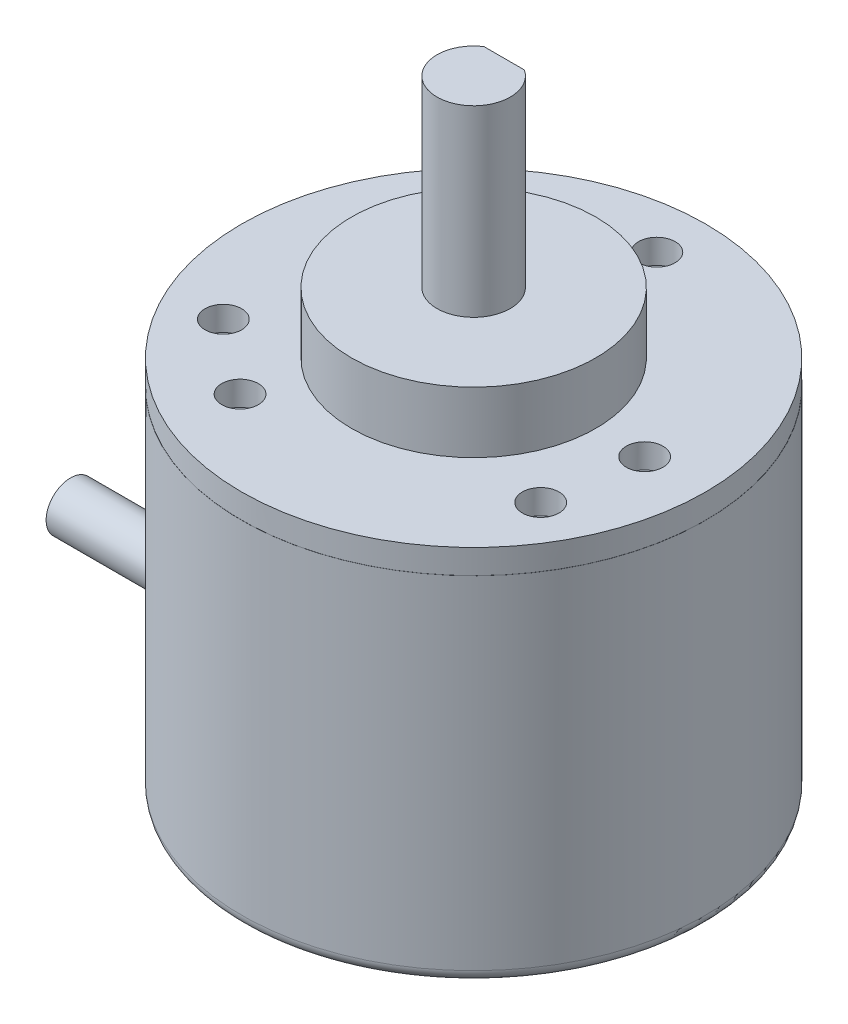
ISO-10303-21;
HEADER;
FILE_DESCRIPTION(('STEP AP214'),'2;1');
FILE_NAME('part.step','',(''),(''),'','','');
FILE_SCHEMA(('AUTOMOTIVE_DESIGN { 1 0 10303 214 1 1 1 1 }'));
ENDSEC;
DATA;
#1=APPLICATION_CONTEXT('core data for automotive mechanical design processes');
#2=APPLICATION_PROTOCOL_DEFINITION('international standard','automotive_design',2000,#1);
#3=PRODUCT_CONTEXT('',#1,'mechanical');
#4=PRODUCT('Part','Part','',(#3));
#5=PRODUCT_RELATED_PRODUCT_CATEGORY('part','',(#4));
#6=PRODUCT_DEFINITION_FORMATION('','',#4);
#7=PRODUCT_DEFINITION_CONTEXT('part definition',#1,'design');
#8=PRODUCT_DEFINITION('design','',#6,#7);
#9=PRODUCT_DEFINITION_SHAPE('','',#8);
#10=(LENGTH_UNIT() NAMED_UNIT(*) SI_UNIT(.MILLI.,.METRE.));
#11=(NAMED_UNIT(*) PLANE_ANGLE_UNIT() SI_UNIT($,.RADIAN.));
#12=(NAMED_UNIT(*) SI_UNIT($,.STERADIAN.) SOLID_ANGLE_UNIT());
#13=UNCERTAINTY_MEASURE_WITH_UNIT(LENGTH_MEASURE(1.E-05),#10,'distance_accuracy_value','');
#14=(GEOMETRIC_REPRESENTATION_CONTEXT(3) GLOBAL_UNCERTAINTY_ASSIGNED_CONTEXT((#13)) GLOBAL_UNIT_ASSIGNED_CONTEXT((#10,
#11,#12)) REPRESENTATION_CONTEXT('',''));
#15=CARTESIAN_POINT('',(0.,0.,0.));
#16=DIRECTION('',(0.,0.,1.));
#17=DIRECTION('',(1.,0.,0.));
#18=AXIS2_PLACEMENT_3D('',#15,#16,#17);
#19=CARTESIAN_POINT('',(0.,31.,0.));
#20=DIRECTION('',(0.,-1.,0.));
#21=DIRECTION('',(0.,0.,-1.));
#22=AXIS2_PLACEMENT_3D('',#19,#20,#21);
#23=CYLINDRICAL_SURFACE('',#22,19.);
#24=CARTESIAN_POINT('',(0.,31.,0.));
#25=DIRECTION('',(0.,1.,0.));
#26=DIRECTION('',(0.,0.,1.));
#27=AXIS2_PLACEMENT_3D('',#24,#25,#26);
#28=CIRCLE('',#27,19.);
#29=CARTESIAN_POINT('',(0.,31.,19.));
#30=VERTEX_POINT('',#29);
#31=EDGE_CURVE('E137',#30,#30,#28,.T.);
#32=ORIENTED_EDGE('',*,*,#31,.F.);
#33=EDGE_LOOP('',(#32));
#34=FACE_BOUND('',#33,.T.);
#35=CARTESIAN_POINT('',(0.,29.,0.));
#36=DIRECTION('',(0.,-1.,0.));
#37=DIRECTION('',(0.,0.,-1.));
#38=AXIS2_PLACEMENT_3D('',#35,#36,#37);
#39=CIRCLE('',#38,19.);
#40=CARTESIAN_POINT('',(0.,29.,-19.));
#41=VERTEX_POINT('',#40);
#42=EDGE_CURVE('E222',#41,#41,#39,.T.);
#43=ORIENTED_EDGE('',*,*,#42,.F.);
#44=EDGE_LOOP('',(#43));
#45=FACE_BOUND('',#44,.T.);
#46=ADVANCED_FACE('F47',(#34,#45),#23,.T.);
#47=CARTESIAN_POINT('',(14.,26.,0.));
#48=DIRECTION('',(0.,1.,0.));
#49=DIRECTION('',(0.,0.,1.));
#50=AXIS2_PLACEMENT_3D('',#47,#48,#49);
#51=CYLINDRICAL_SURFACE('',#50,1.5);
#52=CARTESIAN_POINT('',(14.,31.,0.));
#53=DIRECTION('',(0.,1.,0.));
#54=DIRECTION('',(0.,0.,1.));
#55=AXIS2_PLACEMENT_3D('',#52,#53,#54);
#56=CIRCLE('',#55,1.5);
#57=CARTESIAN_POINT('',(14.,31.,1.5));
#58=VERTEX_POINT('',#57);
#59=EDGE_CURVE('E270',#58,#58,#56,.T.);
#60=ORIENTED_EDGE('',*,*,#59,.T.);
#61=EDGE_LOOP('',(#60));
#62=FACE_BOUND('',#61,.T.);
#63=CARTESIAN_POINT('',(14.,29.,0.));
#64=DIRECTION('',(0.,-1.,0.));
#65=DIRECTION('',(0.,0.,-1.));
#66=AXIS2_PLACEMENT_3D('',#63,#64,#65);
#67=CIRCLE('',#66,1.5);
#68=CARTESIAN_POINT('',(14.,29.,-1.5));
#69=VERTEX_POINT('',#68);
#70=EDGE_CURVE('E225',#69,#69,#67,.F.);
#71=ORIENTED_EDGE('',*,*,#70,.F.);
#72=EDGE_LOOP('',(#71));
#73=FACE_BOUND('',#72,.T.);
#74=ADVANCED_FACE('F210',(#62,#73),#51,.F.);
#75=CARTESIAN_POINT('',(-7.00000000000002,26.,-12.1243556529821));
#76=DIRECTION('',(0.,1.,0.));
#77=DIRECTION('',(0.,0.,1.));
#78=AXIS2_PLACEMENT_3D('',#75,#76,#77);
#79=CYLINDRICAL_SURFACE('',#78,1.5);
#80=CARTESIAN_POINT('',(-7.00000000000002,31.,-12.1243556529821));
#81=DIRECTION('',(0.,1.,0.));
#82=DIRECTION('',(0.,0.,1.));
#83=AXIS2_PLACEMENT_3D('',#80,#81,#82);
#84=CIRCLE('',#83,1.5);
#85=CARTESIAN_POINT('',(-7.00000000000002,31.,-10.6243556529821));
#86=VERTEX_POINT('',#85);
#87=EDGE_CURVE('E253',#86,#86,#84,.T.);
#88=ORIENTED_EDGE('',*,*,#87,.T.);
#89=EDGE_LOOP('',(#88));
#90=FACE_BOUND('',#89,.T.);
#91=CARTESIAN_POINT('',(-7.00000000000002,29.,-12.1243556529821));
#92=DIRECTION('',(0.,-1.,0.));
#93=DIRECTION('',(0.,0.,-1.));
#94=AXIS2_PLACEMENT_3D('',#91,#92,#93);
#95=CIRCLE('',#94,1.5);
#96=CARTESIAN_POINT('',(-7.00000000000002,29.,-13.6243556529821));
#97=VERTEX_POINT('',#96);
#98=EDGE_CURVE('E230',#97,#97,#95,.F.);
#99=ORIENTED_EDGE('',*,*,#98,.F.);
#100=EDGE_LOOP('',(#99));
#101=FACE_BOUND('',#100,.T.);
#102=ADVANCED_FACE('F215',(#90,#101),#79,.F.);
#103=CARTESIAN_POINT('',(12.9903810567666,26.,7.50000000000001));
#104=DIRECTION('',(0.,1.,0.));
#105=DIRECTION('',(0.,0.,1.));
#106=AXIS2_PLACEMENT_3D('',#103,#104,#105);
#107=CYLINDRICAL_SURFACE('',#106,1.5);
#108=CARTESIAN_POINT('',(12.9903810567666,31.,7.50000000000001));
#109=DIRECTION('',(0.,1.,0.));
#110=DIRECTION('',(0.,0.,1.));
#111=AXIS2_PLACEMENT_3D('',#108,#109,#110);
#112=CIRCLE('',#111,1.5);
#113=CARTESIAN_POINT('',(12.9903810567666,31.,9.00000000000001));
#114=VERTEX_POINT('',#113);
#115=EDGE_CURVE('E266',#114,#114,#112,.T.);
#116=ORIENTED_EDGE('',*,*,#115,.T.);
#117=EDGE_LOOP('',(#116));
#118=FACE_BOUND('',#117,.T.);
#119=CARTESIAN_POINT('',(12.9903810567666,29.,7.50000000000001));
#120=DIRECTION('',(0.,-1.,0.));
#121=DIRECTION('',(0.,0.,-1.));
#122=AXIS2_PLACEMENT_3D('',#119,#120,#121);
#123=CIRCLE('',#122,1.5);
#124=CARTESIAN_POINT('',(12.9903810567666,29.,6.00000000000001));
#125=VERTEX_POINT('',#124);
#126=EDGE_CURVE('E366',#125,#125,#123,.F.);
#127=ORIENTED_EDGE('',*,*,#126,.F.);
#128=EDGE_LOOP('',(#127));
#129=FACE_BOUND('',#128,.T.);
#130=ADVANCED_FACE('F377',(#118,#129),#107,.F.);
#131=CARTESIAN_POINT('',(-7.00000000000006,26.,12.1243556529821));
#132=DIRECTION('',(0.,1.,0.));
#133=DIRECTION('',(0.,0.,1.));
#134=AXIS2_PLACEMENT_3D('',#131,#132,#133);
#135=CYLINDRICAL_SURFACE('',#134,1.5);
#136=CARTESIAN_POINT('',(-7.00000000000006,31.,12.1243556529821));
#137=DIRECTION('',(0.,1.,0.));
#138=DIRECTION('',(0.,0.,1.));
#139=AXIS2_PLACEMENT_3D('',#136,#137,#138);
#140=CIRCLE('',#139,1.5);
#141=CARTESIAN_POINT('',(-7.00000000000006,31.,13.6243556529821));
#142=VERTEX_POINT('',#141);
#143=EDGE_CURVE('E262',#142,#142,#140,.T.);
#144=ORIENTED_EDGE('',*,*,#143,.T.);
#145=EDGE_LOOP('',(#144));
#146=FACE_BOUND('',#145,.T.);
#147=CARTESIAN_POINT('',(-7.00000000000006,29.,12.1243556529821));
#148=DIRECTION('',(0.,-1.,0.));
#149=DIRECTION('',(0.,0.,-1.));
#150=AXIS2_PLACEMENT_3D('',#147,#148,#149);
#151=CIRCLE('',#150,1.5);
#152=CARTESIAN_POINT('',(-7.00000000000006,29.,10.6243556529821));
#153=VERTEX_POINT('',#152);
#154=EDGE_CURVE('E361',#153,#153,#151,.F.);
#155=ORIENTED_EDGE('',*,*,#154,.F.);
#156=EDGE_LOOP('',(#155));
#157=FACE_BOUND('',#156,.T.);
#158=ADVANCED_FACE('F382',(#146,#157),#135,.F.);
#159=CARTESIAN_POINT('',(-12.9903810567666,26.,7.49999999999992));
#160=DIRECTION('',(0.,1.,0.));
#161=DIRECTION('',(0.,0.,1.));
#162=AXIS2_PLACEMENT_3D('',#159,#160,#161);
#163=CYLINDRICAL_SURFACE('',#162,1.5);
#164=CARTESIAN_POINT('',(-12.9903810567666,31.,7.49999999999992));
#165=DIRECTION('',(0.,1.,0.));
#166=DIRECTION('',(0.,0.,1.));
#167=AXIS2_PLACEMENT_3D('',#164,#165,#166);
#168=CIRCLE('',#167,1.5);
#169=CARTESIAN_POINT('',(-12.9903810567666,31.,8.99999999999992));
#170=VERTEX_POINT('',#169);
#171=EDGE_CURVE('E258',#170,#170,#168,.T.);
#172=ORIENTED_EDGE('',*,*,#171,.T.);
#173=EDGE_LOOP('',(#172));
#174=FACE_BOUND('',#173,.T.);
#175=CARTESIAN_POINT('',(-12.9903810567666,29.,7.49999999999992));
#176=DIRECTION('',(0.,-1.,0.));
#177=DIRECTION('',(0.,0.,-1.));
#178=AXIS2_PLACEMENT_3D('',#175,#176,#177);
#179=CIRCLE('',#178,1.5);
#180=CARTESIAN_POINT('',(-12.9903810567666,29.,5.99999999999993));
#181=VERTEX_POINT('',#180);
#182=EDGE_CURVE('E358',#181,#181,#179,.F.);
#183=ORIENTED_EDGE('',*,*,#182,.F.);
#184=EDGE_LOOP('',(#183));
#185=FACE_BOUND('',#184,.T.);
#186=ADVANCED_FACE('F303',(#174,#185),#163,.F.);
#187=CARTESIAN_POINT('',(0.,26.,-15.));
#188=DIRECTION('',(0.,1.,0.));
#189=DIRECTION('',(0.,0.,1.));
#190=AXIS2_PLACEMENT_3D('',#187,#188,#189);
#191=CYLINDRICAL_SURFACE('',#190,1.5);
#192=CARTESIAN_POINT('',(0.,31.,-15.));
#193=DIRECTION('',(0.,1.,0.));
#194=DIRECTION('',(0.,0.,1.));
#195=AXIS2_PLACEMENT_3D('',#192,#193,#194);
#196=CIRCLE('',#195,1.5);
#197=CARTESIAN_POINT('',(0.,31.,-13.5));
#198=VERTEX_POINT('',#197);
#199=EDGE_CURVE('E257',#198,#198,#196,.T.);
#200=ORIENTED_EDGE('',*,*,#199,.T.);
#201=EDGE_LOOP('',(#200));
#202=FACE_BOUND('',#201,.T.);
#203=CARTESIAN_POINT('',(0.,29.,-15.));
#204=DIRECTION('',(0.,-1.,0.));
#205=DIRECTION('',(0.,0.,-1.));
#206=AXIS2_PLACEMENT_3D('',#203,#204,#205);
#207=CIRCLE('',#206,1.5);
#208=CARTESIAN_POINT('',(0.,29.,-16.5));
#209=VERTEX_POINT('',#208);
#210=EDGE_CURVE('E152',#209,#209,#207,.F.);
#211=ORIENTED_EDGE('',*,*,#210,.F.);
#212=EDGE_LOOP('',(#211));
#213=FACE_BOUND('',#212,.T.);
#214=ADVANCED_FACE('F298',(#202,#213),#191,.F.);
#215=CARTESIAN_POINT('',(0.,31.,0.));
#216=DIRECTION('',(0.,1.,0.));
#217=DIRECTION('',(0.,0.,1.));
#218=AXIS2_PLACEMENT_3D('',#215,#216,#217);
#219=PLANE('',#218);
#220=ORIENTED_EDGE('',*,*,#199,.F.);
#221=EDGE_LOOP('',(#220));
#222=FACE_BOUND('',#221,.T.);
#223=ORIENTED_EDGE('',*,*,#171,.F.);
#224=EDGE_LOOP('',(#223));
#225=FACE_BOUND('',#224,.T.);
#226=ORIENTED_EDGE('',*,*,#143,.F.);
#227=EDGE_LOOP('',(#226));
#228=FACE_BOUND('',#227,.T.);
#229=ORIENTED_EDGE('',*,*,#115,.F.);
#230=EDGE_LOOP('',(#229));
#231=FACE_BOUND('',#230,.T.);
#232=ORIENTED_EDGE('',*,*,#87,.F.);
#233=EDGE_LOOP('',(#232));
#234=FACE_BOUND('',#233,.T.);
#235=ORIENTED_EDGE('',*,*,#59,.F.);
#236=EDGE_LOOP('',(#235));
#237=FACE_BOUND('',#236,.T.);
#238=CARTESIAN_POINT('',(0.,31.,0.));
#239=DIRECTION('',(0.,1.,0.));
#240=DIRECTION('',(0.,0.,1.));
#241=AXIS2_PLACEMENT_3D('',#238,#239,#240);
#242=CIRCLE('',#241,10.);
#243=CARTESIAN_POINT('',(0.,31.,10.));
#244=VERTEX_POINT('',#243);
#245=EDGE_CURVE('E133',#244,#244,#242,.T.);
#246=ORIENTED_EDGE('',*,*,#245,.F.);
#247=EDGE_LOOP('',(#246));
#248=FACE_BOUND('',#247,.T.);
#249=ORIENTED_EDGE('',*,*,#31,.T.);
#250=EDGE_LOOP('',(#249));
#251=FACE_BOUND('',#250,.T.);
#252=ADVANCED_FACE('F295',(#222,#225,#228,#231,#234,#237,#248,#251),#219,.T.);
#253=CARTESIAN_POINT('',(0.,36.,0.));
#254=DIRECTION('',(0.,-1.,0.));
#255=DIRECTION('',(0.,0.,-1.));
#256=AXIS2_PLACEMENT_3D('',#253,#254,#255);
#257=CYLINDRICAL_SURFACE('',#256,10.);
#258=CARTESIAN_POINT('',(0.,36.,0.));
#259=DIRECTION('',(0.,1.,0.));
#260=DIRECTION('',(0.,0.,1.));
#261=AXIS2_PLACEMENT_3D('',#258,#259,#260);
#262=CIRCLE('',#261,10.);
#263=CARTESIAN_POINT('',(0.,36.,10.));
#264=VERTEX_POINT('',#263);
#265=EDGE_CURVE('E127',#264,#264,#262,.T.);
#266=ORIENTED_EDGE('',*,*,#265,.F.);
#267=EDGE_LOOP('',(#266));
#268=FACE_BOUND('',#267,.T.);
#269=ORIENTED_EDGE('',*,*,#245,.T.);
#270=EDGE_LOOP('',(#269));
#271=FACE_BOUND('',#270,.T.);
#272=ADVANCED_FACE('F292',(#268,#271),#257,.T.);
#273=CARTESIAN_POINT('',(0.,36.,0.));
#274=DIRECTION('',(0.,1.,0.));
#275=DIRECTION('',(0.,0.,1.));
#276=AXIS2_PLACEMENT_3D('',#273,#274,#275);
#277=PLANE('',#276);
#278=CARTESIAN_POINT('',(0.,36.,0.));
#279=DIRECTION('',(0.,1.,0.));
#280=DIRECTION('',(0.,0.,1.));
#281=AXIS2_PLACEMENT_3D('',#278,#279,#280);
#282=CIRCLE('',#281,3.);
#283=CARTESIAN_POINT('',(0.,36.,3.));
#284=VERTEX_POINT('',#283);
#285=EDGE_CURVE('E128',#284,#284,#282,.T.);
#286=ORIENTED_EDGE('',*,*,#285,.F.);
#287=EDGE_LOOP('',(#286));
#288=FACE_BOUND('',#287,.T.);
#289=ORIENTED_EDGE('',*,*,#265,.T.);
#290=EDGE_LOOP('',(#289));
#291=FACE_BOUND('',#290,.T.);
#292=ADVANCED_FACE('F286',(#288,#291),#277,.T.);
#293=CARTESIAN_POINT('',(0.,51.,0.));
#294=DIRECTION('',(0.,-1.,0.));
#295=DIRECTION('',(0.,0.,-1.));
#296=AXIS2_PLACEMENT_3D('',#293,#294,#295);
#297=CYLINDRICAL_SURFACE('',#296,3.);
#298=CARTESIAN_POINT('',(0.,51.,0.));
#299=DIRECTION('',(0.,1.,0.));
#300=DIRECTION('',(0.,0.,1.));
#301=AXIS2_PLACEMENT_3D('',#298,#299,#300);
#302=CIRCLE('',#301,3.);
#303=CARTESIAN_POINT('',(-1.6583123951777,51.,-2.5));
#304=VERTEX_POINT('',#303);
#305=CARTESIAN_POINT('',(1.6583123951777,51.,-2.5));
#306=VERTEX_POINT('',#305);
#307=EDGE_CURVE('E118',#304,#306,#302,.T.);
#308=ORIENTED_EDGE('',*,*,#307,.F.);
#309=DIRECTION('',(0.,1.,0.));
#310=VECTOR('',#309,1.);
#311=CARTESIAN_POINT('',(-1.6583123951777,41.,-2.5));
#312=LINE('',#311,#310);
#313=CARTESIAN_POINT('',(-1.6583123951777,41.,-2.5));
#314=VERTEX_POINT('',#313);
#315=EDGE_CURVE('E109',#314,#304,#312,.T.);
#316=ORIENTED_EDGE('',*,*,#315,.F.);
#317=CARTESIAN_POINT('',(0.,41.,0.));
#318=DIRECTION('',(0.,1.,0.));
#319=DIRECTION('',(0.,0.,-1.));
#320=AXIS2_PLACEMENT_3D('',#317,#318,#319);
#321=CIRCLE('',#320,3.);
#322=CARTESIAN_POINT('',(1.6583123951777,41.,-2.5));
#323=VERTEX_POINT('',#322);
#324=EDGE_CURVE('E97',#323,#314,#321,.T.);
#325=ORIENTED_EDGE('',*,*,#324,.F.);
#326=DIRECTION('',(0.,1.,0.));
#327=VECTOR('',#326,1.);
#328=CARTESIAN_POINT('',(1.6583123951777,41.,-2.5));
#329=LINE('',#328,#327);
#330=EDGE_CURVE('E111',#323,#306,#329,.T.);
#331=ORIENTED_EDGE('',*,*,#330,.T.);
#332=EDGE_LOOP('',(#308,#316,#325,#331));
#333=FACE_BOUND('',#332,.T.);
#334=ORIENTED_EDGE('',*,*,#285,.T.);
#335=EDGE_LOOP('',(#334));
#336=FACE_BOUND('',#335,.T.);
#337=ADVANCED_FACE('F115',(#333,#336),#297,.T.);
#338=CARTESIAN_POINT('',(0.,51.,0.));
#339=DIRECTION('',(0.,1.,0.));
#340=DIRECTION('',(0.,0.,1.));
#341=AXIS2_PLACEMENT_3D('',#338,#339,#340);
#342=PLANE('',#341);
#343=DIRECTION('',(1.,0.,0.));
#344=VECTOR('',#343,1.);
#345=CARTESIAN_POINT('',(1.6583123951777,51.,-2.5));
#346=LINE('',#345,#344);
#347=EDGE_CURVE('E105',#304,#306,#346,.T.);
#348=ORIENTED_EDGE('',*,*,#347,.F.);
#349=ORIENTED_EDGE('',*,*,#307,.T.);
#350=EDGE_LOOP('',(#348,#349));
#351=FACE_BOUND('',#350,.T.);
#352=ADVANCED_FACE('F278',(#351),#342,.T.);
#353=CARTESIAN_POINT('',(1.6583123951777,41.,-2.5));
#354=DIRECTION('',(0.,0.,1.));
#355=DIRECTION('',(1.,0.,0.));
#356=AXIS2_PLACEMENT_3D('',#353,#354,#355);
#357=PLANE('',#356);
#358=ORIENTED_EDGE('',*,*,#347,.T.);
#359=ORIENTED_EDGE('',*,*,#330,.F.);
#360=DIRECTION('',(1.,0.,0.));
#361=VECTOR('',#360,1.);
#362=CARTESIAN_POINT('',(1.6583123951777,41.,-2.5));
#363=LINE('',#362,#361);
#364=EDGE_CURVE('E100',#314,#323,#363,.T.);
#365=ORIENTED_EDGE('',*,*,#364,.F.);
#366=ORIENTED_EDGE('',*,*,#315,.T.);
#367=EDGE_LOOP('',(#358,#359,#365,#366));
#368=FACE_BOUND('',#367,.T.);
#369=ADVANCED_FACE('F108',(#368),#357,.F.);
#370=CARTESIAN_POINT('',(0.,41.,0.));
#371=DIRECTION('',(0.,-1.,0.));
#372=DIRECTION('',(0.,0.,-1.));
#373=AXIS2_PLACEMENT_3D('',#370,#371,#372);
#374=PLANE('',#373);
#375=ORIENTED_EDGE('',*,*,#324,.T.);
#376=ORIENTED_EDGE('',*,*,#364,.T.);
#377=EDGE_LOOP('',(#375,#376));
#378=FACE_BOUND('',#377,.T.);
#379=ADVANCED_FACE('F99',(#378),#374,.F.);
#380=CARTESIAN_POINT('',(0.,29.,0.));
#381=DIRECTION('',(0.,-1.,0.));
#382=DIRECTION('',(0.,0.,-1.));
#383=AXIS2_PLACEMENT_3D('',#380,#381,#382);
#384=CYLINDRICAL_SURFACE('',#383,19.01);
#385=CARTESIAN_POINT('',(-18.6850234144889,4.,-3.5));
#386=CARTESIAN_POINT('',(-18.6850271497899,4.19480049835818,-3.49999246251264));
#387=CARTESIAN_POINT('',(-18.6881028198748,4.38969955315677,-3.48368173891515));
#388=CARTESIAN_POINT('',(-18.7000585667795,4.774006609954,-3.41891111118134));
#389=CARTESIAN_POINT('',(-18.7089436403241,4.96340973825599,-3.37042353087813));
#390=CARTESIAN_POINT('',(-18.7314785551958,5.33110854965675,-3.24283480922747));
#391=CARTESIAN_POINT('',(-18.7451240348657,5.50941422501629,-3.16376168428094));
#392=CARTESIAN_POINT('',(-18.7756371001909,5.8502161327094,-2.97731996783644));
#393=CARTESIAN_POINT('',(-18.7925044155999,6.01271368929737,-2.86995374926519));
#394=CARTESIAN_POINT('',(-18.8277867968961,6.31925057579859,-2.62859968791417));
#395=CARTESIAN_POINT('',(-18.8462165574925,6.46307259702537,-2.49433795486279));
#396=CARTESIAN_POINT('',(-18.8824173485137,6.72628347085306,-2.20359601670003));
#397=CARTESIAN_POINT('',(-18.9001883363697,6.845670746765,-2.04711437891842));
#398=CARTESIAN_POINT('',(-18.9332263844455,7.05745305087856,-1.71495040147389));
#399=CARTESIAN_POINT('',(-18.9484741183781,7.14964362751737,-1.53913562012464));
#400=CARTESIAN_POINT('',(-18.9745833277247,7.30309889380294,-1.17418595220083));
#401=CARTESIAN_POINT('',(-18.9854451508243,7.36436603494865,-0.985052122867604));
#402=CARTESIAN_POINT('',(-19.0014549224012,7.45356452127088,-0.601084023792057));
#403=CARTESIAN_POINT('',(-19.0066655845119,7.48186201378783,-0.406337470644602));
#404=CARTESIAN_POINT('',(-19.0110019756179,7.50545841044322,-0.014795869468094));
#405=CARTESIAN_POINT('',(-19.0101282049903,7.50076002812636,0.181999008779864));
#406=CARTESIAN_POINT('',(-19.0024432976165,7.45877966034717,0.569541261841937));
#407=CARTESIAN_POINT('',(-18.9957039969468,7.42189188914685,0.760332969714066));
#408=CARTESIAN_POINT('',(-18.9771257390179,7.31720286837175,1.13297150910291));
#409=CARTESIAN_POINT('',(-18.9652866008682,7.24940052225713,1.31481802308015));
#410=CARTESIAN_POINT('',(-18.9377184552645,7.08442866348992,1.66555259049683));
#411=CARTESIAN_POINT('',(-18.9219685508542,6.98710074204368,1.83436442504282));
#412=CARTESIAN_POINT('',(-18.8883220424718,6.76595711747364,2.15340754268445));
#413=CARTESIAN_POINT('',(-18.870425227797,6.64213881358803,2.30363699911996));
#414=CARTESIAN_POINT('',(-18.8341562105744,6.36935438931519,2.58358552409534));
#415=CARTESIAN_POINT('',(-18.8157808918251,6.22004343216029,2.71296839951389));
#416=CARTESIAN_POINT('',(-18.7808793878309,5.90166302982145,2.94490539204939));
#417=CARTESIAN_POINT('',(-18.7643532277657,5.73259331564868,3.04745914386243));
#418=CARTESIAN_POINT('',(-18.7350171254613,5.37905846802334,3.22291750015359));
#419=CARTESIAN_POINT('',(-18.7222131368016,5.19456927139903,3.29577467925292));
#420=CARTESIAN_POINT('',(-18.7018633792415,4.81568021583761,3.40936491669899));
#421=CARTESIAN_POINT('',(-18.6943170375004,4.62128143906445,3.45010147477303));
#422=CARTESIAN_POINT('',(-18.6854499274208,4.23111908653075,3.49780623579803));
#423=CARTESIAN_POINT('',(-18.6840402371989,4.03541645010133,3.50525680451057));
#424=CARTESIAN_POINT('',(-18.687368275235,3.64556302996132,3.48746983880702));
#425=CARTESIAN_POINT('',(-18.6921057109417,3.45141217284156,3.46223385999482));
#426=CARTESIAN_POINT('',(-18.7071114952799,3.07175019811844,3.38020378290419));
#427=CARTESIAN_POINT('',(-18.7173357250511,2.88618281542163,3.32366130405157));
#428=CARTESIAN_POINT('',(-18.7421252445796,2.52715599816254,3.18088971102058));
#429=CARTESIAN_POINT('',(-18.756690844245,2.35369742907716,3.09465847744751));
#430=CARTESIAN_POINT('',(-18.7887251258721,2.02168333581344,2.89384217326132));
#431=CARTESIAN_POINT('',(-18.8062243704142,1.86331557483539,2.77895163638601));
#432=CARTESIAN_POINT('',(-18.8420676773736,1.56793250514659,2.52449119769814));
#433=CARTESIAN_POINT('',(-18.8604118128096,1.43091904646102,2.38491915984278));
#434=CARTESIAN_POINT('',(-18.8961629701571,1.18033872037128,2.08290618059955));
#435=CARTESIAN_POINT('',(-18.9135549190237,1.06709580600005,1.92019439144974));
#436=CARTESIAN_POINT('',(-18.9451905639972,0.86955449816874,1.57777508618267));
#437=CARTESIAN_POINT('',(-18.9594343782195,0.78525501871008,1.39806820806794));
#438=CARTESIAN_POINT('',(-18.9831039229964,0.648481768027139,1.0276664183557));
#439=CARTESIAN_POINT('',(-18.9925539666657,0.595847140287038,0.837032525600698));
#440=CARTESIAN_POINT('',(-19.0056747700004,0.523383490156286,0.449440515212744));
#441=CARTESIAN_POINT('',(-19.0093461150383,0.503551144938332,0.252483040210967));
#442=CARTESIAN_POINT('',(-19.0104847931259,0.497367311756134,-0.139055179705857));
#443=CARTESIAN_POINT('',(-19.0080429024004,0.510525940856246,-0.333628093745679));
#444=CARTESIAN_POINT('',(-18.9974175452422,0.568879876851544,-0.717740616100788));
#445=CARTESIAN_POINT('',(-18.9892341296652,0.614074899984147,-0.907280268982792));
#446=CARTESIAN_POINT('',(-18.9680444979482,0.735015319504796,-1.27569915730537));
#447=CARTESIAN_POINT('',(-18.9550462374266,0.810710338438936,-1.45459541616528));
#448=CARTESIAN_POINT('',(-18.9256359955418,0.990444090075727,-1.79722155005095));
#449=CARTESIAN_POINT('',(-18.909223796523,1.09448463007794,-1.96095045711989));
#450=CARTESIAN_POINT('',(-18.8745116181734,1.32965100139343,-2.27104005457607));
#451=CARTESIAN_POINT('',(-18.8561886648984,1.46113160843305,-2.41712914860412));
#452=CARTESIAN_POINT('',(-18.8198674061536,1.74670801791736,-2.6853407390396));
#453=CARTESIAN_POINT('',(-18.8018691779558,1.90080912550043,-2.807457597543));
#454=CARTESIAN_POINT('',(-18.768061096526,2.22888566922508,-3.02527253257103));
#455=CARTESIAN_POINT('',(-18.7522720683495,2.40302525364685,-3.1207266880977));
#456=CARTESIAN_POINT('',(-18.7249197851861,2.76510090538183,-3.28087394456315));
#457=CARTESIAN_POINT('',(-18.7133525038514,2.95302362094361,-3.34559637267283));
#458=CARTESIAN_POINT('',(-18.6981917096431,3.28461065803876,-3.42913407151765));
#459=CARTESIAN_POINT('',(-18.6932826002395,3.42632155847498,-3.45566375491885));
#460=CARTESIAN_POINT('',(-18.6866971130583,3.71200371970312,-3.49109928075716));
#461=CARTESIAN_POINT('',(-18.6850206528071,3.85597492273407,-3.50000557281531));
#462=CARTESIAN_POINT('',(-18.6850234144889,4.,-3.5));
#463=B_SPLINE_CURVE_WITH_KNOTS('',3,(#385,#386,#387,#388,#389,#390,#391,#392,#393,#394,#395,
#396,#397,#398,#399,#400,#401,#402,#403,#404,#405,#406,#407,#408,#409,#410,#411,#412,#413,#414,
#415,#416,#417,#418,#419,#420,#421,#422,#423,#424,#425,#426,#427,#428,#429,#430,#431,#432,#433,
#434,#435,#436,#437,#438,#439,#440,#441,#442,#443,#444,#445,#446,#447,#448,#449,#450,#451,#452,
#453,#454,#455,#456,#457,#458,#459,#460,#461,#462),.UNSPECIFIED.,.T.,.F.,(4,2,2,2,2,2,2,2,2,2,2,
2,2,2,2,2,2,2,2,2,2,2,2,2,2,2,2,2,2,2,2,2,2,2,2,2,2,2,4),(0.,0.583874501636153,1.16825186125438,
1.75209519323508,2.3358895741619,2.92596251373225,3.51607351665726,4.11051380755095,
4.7049069659478,5.29263414755737,5.88031299569158,6.46089414425631,7.04149588763418,
7.6252694478116,8.20910034779031,8.80156570148922,9.39403912174491,9.98745504848237,
10.5808063101872,11.1655304984126,11.7502268597222,12.3302906665697,12.9103958910909,
13.4969701988726,14.0835952961734,14.67775940326,15.2719012140326,15.8629987400072,
16.4540363849257,17.0363498450872,17.6186581474676,18.2000085566542,18.7813960411983,
19.3708261769397,19.9603947720108,20.5551923996786,21.1494212677332,21.5811178826548,
22.0128034836697),.UNSPECIFIED.);
#464=CARTESIAN_POINT('',(-18.9243256154612,1.,-1.802775637732));
#465=VERTEX_POINT('',#464);
#466=CARTESIAN_POINT('',(-18.9243256154612,1.,1.802775637732));
#467=VERTEX_POINT('',#466);
#468=EDGE_CURVE('E153',#465,#467,#463,.T.);
#469=ORIENTED_EDGE('',*,*,#468,.T.);
#470=CARTESIAN_POINT('',(0.,1.,0.));
#471=DIRECTION('',(0.,1.,0.));
#472=DIRECTION('',(0.,0.,1.));
#473=AXIS2_PLACEMENT_3D('',#470,#471,#472);
#474=CIRCLE('',#473,19.01);
#475=EDGE_CURVE('E11',#467,#465,#474,.T.);
#476=ORIENTED_EDGE('',*,*,#475,.T.);
#477=EDGE_LOOP('',(#469,#476));
#478=FACE_BOUND('',#477,.T.);
#479=CARTESIAN_POINT('',(0.,29.,0.));
#480=DIRECTION('',(0.,-1.,0.));
#481=DIRECTION('',(0.,0.,-1.));
#482=AXIS2_PLACEMENT_3D('',#479,#480,#481);
#483=CIRCLE('',#482,19.01);
#484=CARTESIAN_POINT('',(0.,29.,-19.01));
#485=VERTEX_POINT('',#484);
#486=EDGE_CURVE('E193',#485,#485,#483,.T.);
#487=ORIENTED_EDGE('',*,*,#486,.T.);
#488=EDGE_LOOP('',(#487));
#489=FACE_BOUND('',#488,.T.);
#490=ADVANCED_FACE('F159',(#478,#489),#384,.T.);
#491=CARTESIAN_POINT('',(0.,29.,0.));
#492=DIRECTION('',(0.,-1.,0.));
#493=DIRECTION('',(0.,0.,-1.));
#494=AXIS2_PLACEMENT_3D('',#491,#492,#493);
#495=PLANE('',#494);
#496=ORIENTED_EDGE('',*,*,#486,.F.);
#497=EDGE_LOOP('',(#496));
#498=FACE_BOUND('',#497,.T.);
#499=ORIENTED_EDGE('',*,*,#42,.T.);
#500=EDGE_LOOP('',(#499));
#501=FACE_BOUND('',#500,.T.);
#502=ADVANCED_FACE('F164',(#498,#501),#495,.F.);
#503=CARTESIAN_POINT('',(-33.,4.,0.));
#504=DIRECTION('',(-1.,0.,0.));
#505=DIRECTION('',(0.,0.,1.));
#506=AXIS2_PLACEMENT_3D('',#503,#504,#505);
#507=PLANE('',#506);
#508=CARTESIAN_POINT('',(-33.,4.,0.));
#509=DIRECTION('',(-1.,0.,0.));
#510=DIRECTION('',(0.,0.,1.));
#511=AXIS2_PLACEMENT_3D('',#508,#509,#510);
#512=CIRCLE('',#511,2.);
#513=CARTESIAN_POINT('',(-33.,4.,2.));
#514=VERTEX_POINT('',#513);
#515=EDGE_CURVE('E234',#514,#514,#512,.T.);
#516=ORIENTED_EDGE('',*,*,#515,.T.);
#517=EDGE_LOOP('',(#516));
#518=FACE_BOUND('',#517,.T.);
#519=ADVANCED_FACE('F165',(#518),#507,.T.);
#520=CARTESIAN_POINT('',(-33.,4.,0.));
#521=DIRECTION('',(1.,0.,0.));
#522=DIRECTION('',(0.,0.,-1.));
#523=AXIS2_PLACEMENT_3D('',#520,#521,#522);
#524=CYLINDRICAL_SURFACE('',#523,2.);
#525=ORIENTED_EDGE('',*,*,#515,.F.);
#526=EDGE_LOOP('',(#525));
#527=FACE_BOUND('',#526,.T.);
#528=CARTESIAN_POINT('',(-23.,4.,0.));
#529=DIRECTION('',(-1.,0.,0.));
#530=DIRECTION('',(0.,0.,1.));
#531=AXIS2_PLACEMENT_3D('',#528,#529,#530);
#532=CIRCLE('',#531,2.);
#533=CARTESIAN_POINT('',(-23.,4.,2.));
#534=VERTEX_POINT('',#533);
#535=EDGE_CURVE('E239',#534,#534,#532,.T.);
#536=ORIENTED_EDGE('',*,*,#535,.T.);
#537=EDGE_LOOP('',(#536));
#538=FACE_BOUND('',#537,.T.);
#539=ADVANCED_FACE('F340',(#527,#538),#524,.T.);
#540=CARTESIAN_POINT('',(-23.,4.,0.));
#541=DIRECTION('',(-1.,0.,0.));
#542=DIRECTION('',(0.,0.,1.));
#543=AXIS2_PLACEMENT_3D('',#540,#541,#542);
#544=PLANE('',#543);
#545=ORIENTED_EDGE('',*,*,#535,.F.);
#546=EDGE_LOOP('',(#545));
#547=FACE_BOUND('',#546,.T.);
#548=CARTESIAN_POINT('',(-23.,4.,0.));
#549=DIRECTION('',(-1.,0.,0.));
#550=DIRECTION('',(0.,0.,1.));
#551=AXIS2_PLACEMENT_3D('',#548,#549,#550);
#552=CIRCLE('',#551,2.5);
#553=CARTESIAN_POINT('',(-23.,4.,2.5));
#554=VERTEX_POINT('',#553);
#555=EDGE_CURVE('E238',#554,#554,#552,.T.);
#556=ORIENTED_EDGE('',*,*,#555,.T.);
#557=EDGE_LOOP('',(#556));
#558=FACE_BOUND('',#557,.T.);
#559=ADVANCED_FACE('F554',(#547,#558),#544,.T.);
#560=CARTESIAN_POINT('',(-23.,4.,0.));
#561=DIRECTION('',(1.,0.,0.));
#562=DIRECTION('',(0.,0.,-1.));
#563=AXIS2_PLACEMENT_3D('',#560,#561,#562);
#564=CYLINDRICAL_SURFACE('',#563,2.5);
#565=ORIENTED_EDGE('',*,*,#555,.F.);
#566=EDGE_LOOP('',(#565));
#567=FACE_BOUND('',#566,.T.);
#568=CARTESIAN_POINT('',(-20.,4.,0.));
#569=DIRECTION('',(-1.,0.,0.));
#570=DIRECTION('',(0.,0.,1.));
#571=AXIS2_PLACEMENT_3D('',#568,#569,#570);
#572=CIRCLE('',#571,2.5);
#573=CARTESIAN_POINT('',(-20.,4.,2.5));
#574=VERTEX_POINT('',#573);
#575=EDGE_CURVE('E132',#574,#574,#572,.T.);
#576=ORIENTED_EDGE('',*,*,#575,.T.);
#577=EDGE_LOOP('',(#576));
#578=FACE_BOUND('',#577,.T.);
#579=ADVANCED_FACE('F563',(#567,#578),#564,.T.);
#580=CARTESIAN_POINT('',(-20.,4.,0.));
#581=DIRECTION('',(1.,0.,0.));
#582=DIRECTION('',(0.,0.,-1.));
#583=AXIS2_PLACEMENT_3D('',#580,#581,#582);
#584=PLANE('',#583);
#585=ORIENTED_EDGE('',*,*,#575,.F.);
#586=EDGE_LOOP('',(#585));
#587=FACE_BOUND('',#586,.T.);
#588=CARTESIAN_POINT('',(-20.,4.,0.));
#589=DIRECTION('',(1.,0.,0.));
#590=DIRECTION('',(0.,0.,-1.));
#591=AXIS2_PLACEMENT_3D('',#588,#589,#590);
#592=CIRCLE('',#591,3.5);
#593=CARTESIAN_POINT('',(-20.,4.,-3.5));
#594=VERTEX_POINT('',#593);
#595=EDGE_CURVE('E246',#594,#594,#592,.T.);
#596=ORIENTED_EDGE('',*,*,#595,.F.);
#597=EDGE_LOOP('',(#596));
#598=FACE_BOUND('',#597,.T.);
#599=ADVANCED_FACE('F352',(#587,#598),#584,.F.);
#600=CARTESIAN_POINT('',(-20.,4.,0.));
#601=DIRECTION('',(1.,0.,0.));
#602=DIRECTION('',(0.,0.,-1.));
#603=AXIS2_PLACEMENT_3D('',#600,#601,#602);
#604=CYLINDRICAL_SURFACE('',#603,3.5);
#605=EDGE_CURVE('E144',#467,#465,#463,.T.);
#606=ORIENTED_EDGE('',*,*,#605,.F.);
#607=ORIENTED_EDGE('',*,*,#468,.F.);
#608=EDGE_LOOP('',(#606,#607));
#609=FACE_BOUND('',#608,.T.);
#610=ORIENTED_EDGE('',*,*,#595,.T.);
#611=EDGE_LOOP('',(#610));
#612=FACE_BOUND('',#611,.T.);
#613=ADVANCED_FACE('F155',(#609,#612),#604,.T.);
#614=ORIENTED_EDGE('',*,*,#210,.T.);
#615=EDGE_LOOP('',(#614));
#616=FACE_BOUND('',#615,.T.);
#617=ADVANCED_FACE('F336',(#616),#495,.F.);
#618=ORIENTED_EDGE('',*,*,#182,.T.);
#619=EDGE_LOOP('',(#618));
#620=FACE_BOUND('',#619,.T.);
#621=ADVANCED_FACE('F344',(#620),#495,.F.);
#622=ORIENTED_EDGE('',*,*,#154,.T.);
#623=EDGE_LOOP('',(#622));
#624=FACE_BOUND('',#623,.T.);
#625=ADVANCED_FACE('F350',(#624),#495,.F.);
#626=ORIENTED_EDGE('',*,*,#126,.T.);
#627=EDGE_LOOP('',(#626));
#628=FACE_BOUND('',#627,.T.);
#629=ADVANCED_FACE('F332',(#628),#495,.F.);
#630=ORIENTED_EDGE('',*,*,#98,.T.);
#631=EDGE_LOOP('',(#630));
#632=FACE_BOUND('',#631,.T.);
#633=ADVANCED_FACE('F326',(#632),#495,.F.);
#634=ORIENTED_EDGE('',*,*,#70,.T.);
#635=EDGE_LOOP('',(#634));
#636=FACE_BOUND('',#635,.T.);
#637=ADVANCED_FACE('F324',(#636),#495,.F.);
#638=CARTESIAN_POINT('',(0.,0.,0.));
#639=DIRECTION('',(0.,1.,0.));
#640=DIRECTION('',(0.,0.,1.));
#641=AXIS2_PLACEMENT_3D('',#638,#639,#640);
#642=PLANE('',#641);
#643=CARTESIAN_POINT('',(0.,0.,0.));
#644=DIRECTION('',(0.,1.,0.));
#645=DIRECTION('',(0.,0.,1.));
#646=AXIS2_PLACEMENT_3D('',#643,#644,#645);
#647=CIRCLE('',#646,18.01);
#648=CARTESIAN_POINT('',(-17.9288324215916,0.,-1.7079426215441));
#649=VERTEX_POINT('',#648);
#650=CARTESIAN_POINT('',(-17.9288324215916,0.,1.7079426215441));
#651=VERTEX_POINT('',#650);
#652=EDGE_CURVE('E203',#649,#651,#647,.F.);
#653=ORIENTED_EDGE('',*,*,#652,.T.);
#654=CARTESIAN_POINT('',(-18.8823702837657,1.27716936967956,2.19913455834824));
#655=CARTESIAN_POINT('',(-19.2482523051327,0.,2.15590713211969));
#656=CARTESIAN_POINT('',(-17.9281855522907,0.,2.31186748229496));
#657=CARTESIAN_POINT('',(-18.8885252601925,1.23442030401363,2.14618571518669));
#658=CARTESIAN_POINT('',(-19.1841663381953,0.,2.12938713510745));
#659=CARTESIAN_POINT('',(-17.9169465265014,0.,2.21601210799424));
#660=CARTESIAN_POINT('',(-18.8950272686344,1.19037602404837,2.08850653199662));
#661=CARTESIAN_POINT('',(-19.1244601383189,0.,2.08482421109908));
#662=CARTESIAN_POINT('',(-17.9122288965022,0.,2.1197697675023));
#663=CARTESIAN_POINT('',(-18.9083942293224,1.10188353980562,1.96385840718124));
#664=CARTESIAN_POINT('',(-19.0202597952822,0.,1.97126781724485));
#665=CARTESIAN_POINT('',(-17.9126671755133,0.,1.92800153212133));
#666=CARTESIAN_POINT('',(-18.9152559698785,1.05744113092348,1.89696510885817));
#667=CARTESIAN_POINT('',(-18.9747988086698,0.,1.90352812646281));
#668=CARTESIAN_POINT('',(-17.917746671551,0.,1.83247587932058));
#669=CARTESIAN_POINT('',(-18.9291613449717,0.969327575889582,1.75277124597036));
#670=CARTESIAN_POINT('',(-18.898349775966,0.,1.75197709572703));
#671=CARTESIAN_POINT('',(-17.9345892642831,0.,1.64149015706357));
#672=CARTESIAN_POINT('',(-18.9362058819852,0.92566346898614,1.67540481615293));
#673=CARTESIAN_POINT('',(-18.8666586592639,0.,1.66841576084258));
#674=CARTESIAN_POINT('',(-17.9463963148173,0.,1.54603469426206));
#675=CARTESIAN_POINT('',(-18.9500850584179,0.841294595709033,1.51034407226017));
#676=CARTESIAN_POINT('',(-18.815434998917,0.,1.49101137975903));
#677=CARTESIAN_POINT('',(-17.9739734541234,0.,1.35538091733045));
#678=CARTESIAN_POINT('',(-18.9569188706081,0.80060080113817,1.42261432098419));
#679=CARTESIAN_POINT('',(-18.7953703775792,0.,1.39706352986936));
#680=CARTESIAN_POINT('',(-17.9897573630138,0.,1.26018469505249));
#681=CARTESIAN_POINT('',(-18.9694598769384,0.727144016341582,1.24377167126965));
#682=CARTESIAN_POINT('',(-18.7655875728572,0.,1.20921532235911));
#683=CARTESIAN_POINT('',(-18.0212900536859,0.,1.07691094150473));
#684=CARTESIAN_POINT('',(-18.9752128466067,0.694019700174819,1.15336708507691));
#685=CARTESIAN_POINT('',(-18.7549541535179,0.,1.1157313747008));
#686=CARTESIAN_POINT('',(-18.0369581514428,0.,0.988818471689688));
#687=CARTESIAN_POINT('',(-18.9857395123688,0.634123515008584,0.964731569132946));
#688=CARTESIAN_POINT('',(-18.7392350512116,0.,0.924831683513848));
#689=CARTESIAN_POINT('',(-18.0670581864467,0.,0.812425213070165));
#690=CARTESIAN_POINT('',(-18.990513367206,0.607350616146183,0.866501911648263));
#691=CARTESIAN_POINT('',(-18.7339844186985,0.,0.826989370845557));
#692=CARTESIAN_POINT('',(-18.0814903238581,0.,0.72412446038636));
#693=CARTESIAN_POINT('',(-18.9986740497393,0.561960803737886,0.663739221027304));
#694=CARTESIAN_POINT('',(-18.726788369273,0.,0.628926903712168));
#695=CARTESIAN_POINT('',(-18.1068530379432,0.,0.547433005143077));
#696=CARTESIAN_POINT('',(-19.0020675182496,0.543304810148147,0.559239210771768));
#697=CARTESIAN_POINT('',(-18.7247544795917,0.,0.52818687596515));
#698=CARTESIAN_POINT('',(-18.1178003229594,0.,0.459044834301998));
#699=CARTESIAN_POINT('',(-19.0071456707965,0.515498908650445,0.346095521206106));
#700=CARTESIAN_POINT('',(-18.7222193002915,0.,0.325461959420542));
#701=CARTESIAN_POINT('',(-18.1344024093265,0.,0.281779053645544));
#702=CARTESIAN_POINT('',(-19.0088310824397,0.506344952976501,0.237453626758614));
#703=CARTESIAN_POINT('',(-18.7216947316701,0.,0.222828795899576));
#704=CARTESIAN_POINT('',(-18.1400594641567,0.,0.192901668464285));
#705=CARTESIAN_POINT('',(-19.0102975070879,0.498370365551076,0.0192021344013477));
#706=CARTESIAN_POINT('',(-18.7212239257884,0.,0.0180420434732944));
#707=CARTESIAN_POINT('',(-18.1449776596236,0.,0.0154293418381392));
#708=CARTESIAN_POINT('',(-19.010088536887,0.499495382623542,-0.090399315678302));
#709=CARTESIAN_POINT('',(-18.7212715255649,0.,-0.0848058841449789));
#710=CARTESIAN_POINT('',(-18.1442724417123,0.,-0.0731646101731116));
#711=CARTESIAN_POINT('',(-19.0078216040238,0.511830658475946,-0.307385519017943));
#712=CARTESIAN_POINT('',(-18.7220475566432,0.,-0.288747513193746));
#713=CARTESIAN_POINT('',(-18.136694892107,0.,-0.250098471846909));
#714=CARTESIAN_POINT('',(-19.0057631224278,0.523043747756563,-0.414769641491728));
#715=CARTESIAN_POINT('',(-18.7227816448724,0.,-0.390526547026877));
#716=CARTESIAN_POINT('',(-18.1298208295665,0.,-0.338438303229413));
#717=CARTESIAN_POINT('',(-19.0014466001099,0.546749175461814,-0.572628331330625));
#718=CARTESIAN_POINT('',(-18.7252076141986,0.,-0.540944822165279));
#719=CARTESIAN_POINT('',(-18.1158288976687,0.,-0.47070975402923));
#720=CARTESIAN_POINT('',(-18.9997983296364,0.555824231066371,-0.624814875854799));
#721=CARTESIAN_POINT('',(-18.7262491739412,0.,-0.591129126479052));
#722=CARTESIAN_POINT('',(-18.110536855047,0.,-0.51485039183877));
#723=CARTESIAN_POINT('',(-18.9961372603515,0.576070150562831,-0.727628949323831));
#724=CARTESIAN_POINT('',(-18.7289849490832,0.,-0.690661002751796));
#725=CARTESIAN_POINT('',(-18.0989610294263,0.,-0.603002385516461));
#726=CARTESIAN_POINT('',(-18.9941244583422,0.58724103284094,-0.778256464587146));
#727=CARTESIAN_POINT('',(-18.7306859288923,0.,-0.7400796372836));
#728=CARTESIAN_POINT('',(-18.0926772377269,0.,-0.647013740246999));
#729=CARTESIAN_POINT('',(-18.9876125199853,0.623603259209597,-0.927576877201092));
#730=CARTESIAN_POINT('',(-18.7371523229896,0.,-0.887592277851048));
#731=CARTESIAN_POINT('',(-18.0727267232682,0.,-0.778879041815927));
#732=CARTESIAN_POINT('',(-18.9826399048691,0.651643893287482,-1.02370579062062));
#733=CARTESIAN_POINT('',(-18.7432936250229,0.,-0.984054060586111));
#734=CARTESIAN_POINT('',(-18.0579610415521,0.,-0.866562688764393));
#735=CARTESIAN_POINT('',(-18.9734484140675,0.704231194294738,-1.18004082140891));
#736=CARTESIAN_POINT('',(-18.7583829398741,0.,-1.1428802842941));
#737=CARTESIAN_POINT('',(-18.0322425485205,0.,-1.01519447554989));
#738=CARTESIAN_POINT('',(-18.9694587812919,0.727255609026324,-1.24229521278563));
#739=CARTESIAN_POINT('',(-18.7660248157654,0.,-1.20726353221935));
#740=CARTESIAN_POINT('',(-18.0214925494761,0.,-1.07618052415089));
#741=CARTESIAN_POINT('',(-18.961195937503,0.775485318503539,-1.3625692297508));
#742=CARTESIAN_POINT('',(-18.7847287461449,0.,-1.3329969059379));
#743=CARTESIAN_POINT('',(-18.0003731669921,0.,-1.19814199276272));
#744=CARTESIAN_POINT('',(-18.9569230894832,0.800687833735841,-1.42059408329447));
#745=CARTESIAN_POINT('',(-18.7958763681037,0.,-1.39444345102445));
#746=CARTESIAN_POINT('',(-17.9900033218251,0.,-1.25911732966006));
#747=CARTESIAN_POINT('',(-18.9482049877814,0.85275947525546,-1.53250834059718));
#748=CARTESIAN_POINT('',(-18.8223314452011,0.,-1.51379643727859));
#749=CARTESIAN_POINT('',(-17.9703633450396,0.,-1.38124832156624));
#750=CARTESIAN_POINT('',(-18.9437597362388,0.879628580863839,-1.5863977956494));
#751=CARTESIAN_POINT('',(-18.8377625474513,0.,-1.57175447478153));
#752=CARTESIAN_POINT('',(-17.9610931997802,0.,-1.44240397432878));
#753=CARTESIAN_POINT('',(-18.9347978171779,0.934514301095296,-1.69004033332369));
#754=CARTESIAN_POINT('',(-18.8734773246789,0.,-1.68320820074002));
#755=CARTESIAN_POINT('',(-17.9443752176991,0.,-1.56500554239826));
#756=CARTESIAN_POINT('',(-18.9302811115016,0.962531542482594,-1.73979111051828));
#757=CARTESIAN_POINT('',(-18.8939247456382,0.,-1.73669824361259));
#758=CARTESIAN_POINT('',(-17.9369283921186,0.,-1.6264515995998));
#759=CARTESIAN_POINT('',(-18.9212670842307,1.01922484929509,-1.83523688461649));
#760=CARTESIAN_POINT('',(-18.9402844635272,0.,-1.83795478272574));
#761=CARTESIAN_POINT('',(-17.9246057769739,0.,-1.74978449067612));
#762=CARTESIAN_POINT('',(-18.9167698508686,1.04790252335651,-1.88092027673754));
#763=CARTESIAN_POINT('',(-18.9664091098191,0.,-1.88562265306692));
#764=CARTESIAN_POINT('',(-17.9197371594056,0.,-1.81167207376681));
#765=CARTESIAN_POINT('',(-18.9078944736141,1.10531841538116,-1.96813014338975));
#766=CARTESIAN_POINT('',(-19.0243862396605,0.,-1.97323553354215));
#767=CARTESIAN_POINT('',(-17.9134050091379,0.,-1.93558026987934));
#768=CARTESIAN_POINT('',(-18.9035162324911,1.13405656189286,-2.00966009098338));
#769=CARTESIAN_POINT('',(-19.0564651748265,0.,-2.0130116982245));
#770=CARTESIAN_POINT('',(-17.9119386083745,0.,-1.99760072670412));
#771=CARTESIAN_POINT('',(-18.8948879872437,1.19152853436343,-2.08923947378147));
#772=CARTESIAN_POINT('',(-19.1268309950365,0.,-2.08296450193044));
#773=CARTESIAN_POINT('',(-17.9132588594375,0.,-2.1225071516865));
#774=CARTESIAN_POINT('',(-18.8906406750119,1.2202565428389,-2.12723133127261));
#775=CARTESIAN_POINT('',(-19.1654379095701,0.,-2.11265766990003));
#776=CARTESIAN_POINT('',(-17.9161059977705,0.,-2.18539294640942));
#777=CARTESIAN_POINT('',(-18.882394776298,1.27685223023231,-2.19922040392365));
#778=CARTESIAN_POINT('',(-19.2474513651865,0.,-2.15849211622559));
#779=CARTESIAN_POINT('',(-17.9271495716806,0.,-2.31085995475922));
#780=CARTESIAN_POINT('',(-18.8783969362164,1.30471721248528,-2.23320587896711));
#781=CARTESIAN_POINT('',(-19.2910878161664,0.,-2.1740764038181));
#782=CARTESIAN_POINT('',(-17.9353612888865,0.,-2.37343978216515));
#783=CARTESIAN_POINT('',(-18.87456350839,1.33184597371196,-2.26515980523309));
#784=CARTESIAN_POINT('',(-19.3353748776738,0.,-2.18053939137956));
#785=CARTESIAN_POINT('',(-17.9467436043441,0.,-2.43553864025168));
#786=(BOUNDED_SURFACE() B_SPLINE_SURFACE(3,2,((#654,#655,#656),(#657,#658,#659),(#660,#661,
#662),(#663,#664,#665),(#666,#667,#668),(#669,#670,#671),(#672,#673,#674),(#675,#676,#677),
(#678,#679,#680),(#681,#682,#683),(#684,#685,#686),(#687,#688,#689),(#690,#691,#692),(#693,#694,
#695),(#696,#697,#698),(#699,#700,#701),(#702,#703,#704),(#705,#706,#707),(#708,#709,#710),
(#711,#712,#713),(#714,#715,#716),(#717,#718,#719),(#720,#721,#722),(#723,#724,#725),(#726,#727,
#728),(#729,#730,#731),(#732,#733,#734),(#735,#736,#737),(#738,#739,#740),(#741,#742,#743),
(#744,#745,#746),(#747,#748,#749),(#750,#751,#752),(#753,#754,#755),(#756,#757,#758),(#759,#760,
#761),(#762,#763,#764),(#765,#766,#767),(#768,#769,#770),(#771,#772,#773),(#774,#775,#776),
(#777,#778,#779),(#780,#781,#782),(#783,#784,#785)),.UNSPECIFIED.,.F.,.F.,
.F.) B_SPLINE_SURFACE_WITH_KNOTS((4,2,2,2,2,2,2,2,2,2,2,2,2,2,2,2,2,2,2,2,2,4),(3,3),(0.,
0.288784783801269,0.575326287640473,0.863761708401338,1.15321364981003,1.42164611480518,
1.69003502450061,1.95711703774946,2.22408523018308,2.48964261985145,2.75527454257794,
2.88863615707168,3.02199894157107,3.28872915082761,3.47451097472818,3.66005912420746,
3.84560497187866,4.03125349422071,4.21741577169936,4.40342105753333,4.59205884682655,
4.78123634984784),(0.,1.),
.UNSPECIFIED.) GEOMETRIC_REPRESENTATION_ITEM() RATIONAL_B_SPLINE_SURFACE(((1.,0.601178276592712,
1.),(1.,0.618978841059733,1.),(1.,0.636480867967768,1.),(1.,0.670324613875599,1.),(1.,
0.686674290042264,1.),(1.,0.718043237952975,1.),(1.,0.733053002032826,1.),(1.,0.761283619513471,
1.),(1.,0.774497981905559,1.),(1.,0.797844019753684,1.),(1.,0.808129869717997,1.),(1.,
0.826451662281021,1.),(1.,0.834487969674273,1.),(1.,0.847977060852133,1.),(1.,0.853442234329838,
1.),(1.,0.861549392325979,1.),(1.,0.864192578994155,1.),(1.,0.866496497947429,1.),(1.,
0.866172917302742,1.),(1.,0.86260525206496,1.),(1.,0.859360347809787,1.),(1.,0.852426183116028,
1.),(1.,0.849762762157018,1.),(1.,0.843785471100477,1.),(1.,0.840471595296642,1.),(1.,
0.829608942414807,1.),(1.,0.821139223127919,1.),(1.,0.804939961640597,1.),(1.,0.797765870751592,
1.),(1.,0.78250596406972,1.),(1.,0.774421306384492,1.),(1.,0.757424864420559,1.),(1.,
0.748513090403975,1.),(1.,0.729951355570472,1.),(1.,0.720300988995349,1.),(1.,0.700348015179485,
1.),(1.,0.690043676862974,1.),(1.,0.668918817519052,1.),(1.,0.658098739119356,1.),(1.,
0.635893111200592,1.),(1.,0.624501725951541,1.),(1.,0.601422921044476,1.),(1.,0.589734747648447,
1.),(1.,0.577993989851731,1.))) REPRESENTATION_ITEM('') SURFACE());
#787=CARTESIAN_POINT('',(-17.9281855522907,0.,2.31186748229496));
#788=CARTESIAN_POINT('',(-17.9169465265014,0.,2.21601210799424));
#789=CARTESIAN_POINT('',(-17.9122288965022,0.,2.1197697675023));
#790=CARTESIAN_POINT('',(-17.9126671755132,0.,1.92800153212133));
#791=CARTESIAN_POINT('',(-17.917746671551,0.,1.83247587932058));
#792=CARTESIAN_POINT('',(-17.9345892642831,0.,1.64149015706357));
#793=CARTESIAN_POINT('',(-17.9463963148173,0.,1.54603469426206));
#794=CARTESIAN_POINT('',(-17.9739734541234,0.,1.35538091733045));
#795=CARTESIAN_POINT('',(-17.9897573630138,0.,1.26018469505249));
#796=CARTESIAN_POINT('',(-18.0212900536859,0.,1.07691094150473));
#797=CARTESIAN_POINT('',(-18.0369581514428,0.,0.988818471689688));
#798=CARTESIAN_POINT('',(-18.0670581864467,0.,0.812425213070165));
#799=CARTESIAN_POINT('',(-18.0814903238581,0.,0.72412446038636));
#800=CARTESIAN_POINT('',(-18.1068530379432,0.,0.547433005143077));
#801=CARTESIAN_POINT('',(-18.1178003229594,0.,0.459044834301998));
#802=CARTESIAN_POINT('',(-18.1344024093265,0.,0.281779053645544));
#803=CARTESIAN_POINT('',(-18.1400594641567,0.,0.192901668464285));
#804=CARTESIAN_POINT('',(-18.1449776596236,0.,0.0154293418381392));
#805=CARTESIAN_POINT('',(-18.1442724417123,0.,-0.0731646101731117));
#806=CARTESIAN_POINT('',(-18.136694892107,0.,-0.250098471846909));
#807=CARTESIAN_POINT('',(-18.1298208295665,0.,-0.338438303229413));
#808=CARTESIAN_POINT('',(-18.1158288976687,0.,-0.47070975402923));
#809=CARTESIAN_POINT('',(-18.110536855047,0.,-0.51485039183877));
#810=CARTESIAN_POINT('',(-18.0989610294263,0.,-0.603002385516461));
#811=CARTESIAN_POINT('',(-18.0926772377269,0.,-0.647013740246999));
#812=CARTESIAN_POINT('',(-18.0727267232682,0.,-0.778879041815927));
#813=CARTESIAN_POINT('',(-18.0579610415521,0.,-0.866562688764393));
#814=CARTESIAN_POINT('',(-18.0322425485205,0.,-1.01519447554989));
#815=CARTESIAN_POINT('',(-18.0214925494761,0.,-1.07618052415089));
#816=CARTESIAN_POINT('',(-18.0003731669921,0.,-1.19814199276272));
#817=CARTESIAN_POINT('',(-17.9900033218251,0.,-1.25911732966006));
#818=CARTESIAN_POINT('',(-17.9703633450396,0.,-1.38124832156624));
#819=CARTESIAN_POINT('',(-17.9610931997802,0.,-1.44240397432878));
#820=CARTESIAN_POINT('',(-17.9443752176991,0.,-1.56500554239826));
#821=CARTESIAN_POINT('',(-17.9369283921186,0.,-1.6264515995998));
#822=CARTESIAN_POINT('',(-17.9246057769739,0.,-1.74978449067612));
#823=CARTESIAN_POINT('',(-17.9197371594056,0.,-1.81167207376681));
#824=CARTESIAN_POINT('',(-17.9134050091379,0.,-1.93558026987934));
#825=CARTESIAN_POINT('',(-17.9119386083745,0.,-1.99760072670412));
#826=CARTESIAN_POINT('',(-17.9132588594375,0.,-2.1225071516865));
#827=CARTESIAN_POINT('',(-17.9161059977705,0.,-2.18539294640942));
#828=CARTESIAN_POINT('',(-17.9271495716806,0.,-2.31085995475922));
#829=CARTESIAN_POINT('',(-17.9353612888865,0.,-2.37343978216515));
#830=CARTESIAN_POINT('',(-17.9467436043441,0.,-2.43553864025168));
#831=B_SPLINE_CURVE_WITH_KNOTS('',3,(#787,#788,#789,#790,#791,#792,#793,#794,#795,#796,#797,
#798,#799,#800,#801,#802,#803,#804,#805,#806,#807,#808,#809,#810,#811,#812,#813,#814,#815,#816,
#817,#818,#819,#820,#821,#822,#823,#824,#825,#826,#827,#828,#829,#830),.UNSPECIFIED.,.F.,.F.,(4,
2,2,2,2,2,2,2,2,2,2,2,2,2,2,2,2,2,2,2,2,4),(0.,0.288784783801269,0.575326287640473,
0.863761708401338,1.15321364981003,1.42164611480518,1.69003502450061,1.95711703774946,
2.22408523018308,2.48964261985145,2.75527454257794,2.88863615707168,3.02199894157107,
3.28872915082761,3.47451097472818,3.66005912420746,3.84560497187866,4.03125349422071,
4.21741577169936,4.40342105753333,4.59205884682655,4.78123634984784),.UNSPECIFIED.);
#832=EDGE_CURVE('E63',#651,#649,#831,.T.);
#833=ORIENTED_EDGE('',*,*,#832,.T.);
#834=EDGE_LOOP('',(#653,#833));
#835=FACE_BOUND('',#834,.T.);
#836=ADVANCED_FACE('F204',(#835),#642,.F.);
#837=CARTESIAN_POINT('',(0.,1.,0.));
#838=DIRECTION('',(0.,1.,0.));
#839=DIRECTION('',(0.,0.,1.));
#840=AXIS2_PLACEMENT_3D('',#837,#838,#839);
#841=TOROIDAL_SURFACE('',#840,18.01,1.);
#842=CARTESIAN_POINT('',(-17.9288324215916,1.,-1.7079426215441));
#843=DIRECTION('',(-0.0948330161879009,0.,0.995493193869604));
#844=DIRECTION('',(0.995493193869604,0.,0.094833016187901));
#845=AXIS2_PLACEMENT_3D('',#842,#843,#844);
#846=CIRCLE('',#845,1.);
#847=EDGE_CURVE('E194',#465,#649,#846,.T.);
#848=ORIENTED_EDGE('',*,*,#847,.F.);
#849=ORIENTED_EDGE('',*,*,#475,.F.);
#850=CARTESIAN_POINT('',(-17.9288324215916,1.,1.7079426215441));
#851=DIRECTION('',(-0.0948330161879009,0.,-0.995493193869604));
#852=DIRECTION('',(-0.995493193869604,0.,0.094833016187901));
#853=AXIS2_PLACEMENT_3D('',#850,#851,#852);
#854=CIRCLE('',#853,1.);
#855=EDGE_CURVE('E76',#651,#467,#854,.T.);
#856=ORIENTED_EDGE('',*,*,#855,.F.);
#857=ORIENTED_EDGE('',*,*,#652,.F.);
#858=EDGE_LOOP('',(#848,#849,#856,#857));
#859=FACE_BOUND('',#858,.T.);
#860=ADVANCED_FACE('F49',(#859),#841,.T.);
#861=ORIENTED_EDGE('',*,*,#855,.T.);
#862=ORIENTED_EDGE('',*,*,#605,.T.);
#863=ORIENTED_EDGE('',*,*,#847,.T.);
#864=ORIENTED_EDGE('',*,*,#832,.F.);
#865=EDGE_LOOP('',(#861,#862,#863,#864));
#866=FACE_BOUND('',#865,.T.);
#867=ADVANCED_FACE('F172',(#866),#786,.T.);
#868=CLOSED_SHELL('',(#46,#74,#102,#130,#158,#186,#214,#252,#272,#292,#337,#352,#369,#379,#490,
#502,#519,#539,#559,#579,#599,#613,#617,#621,#625,#629,#633,#637,#836,#860,#867));
#869=MANIFOLD_SOLID_BREP('B2',#868);
#870=ADVANCED_BREP_SHAPE_REPRESENTATION('',(#18,#869),#14);
#871=SHAPE_DEFINITION_REPRESENTATION(#9,#870);
ENDSEC;
END-ISO-10303-21;
